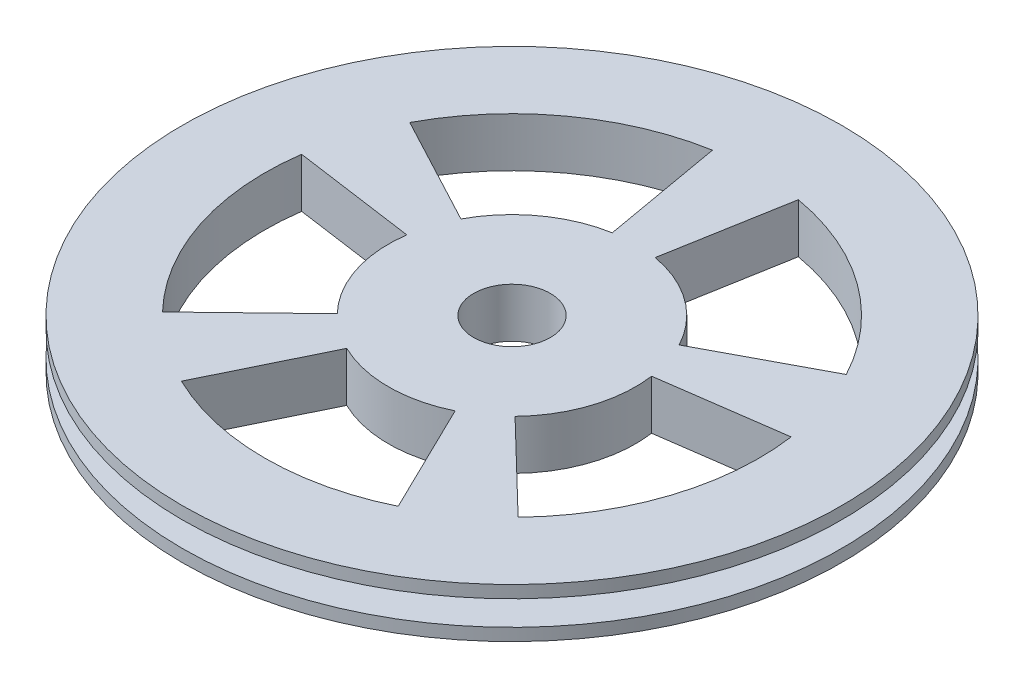
ISO-10303-21;
HEADER;
FILE_DESCRIPTION(('STEP AP214'),'2;1');
FILE_NAME('part.step','',(''),(''),'','','');
FILE_SCHEMA(('AUTOMOTIVE_DESIGN { 1 0 10303 214 1 1 1 1 }'));
ENDSEC;
DATA;
#1=APPLICATION_CONTEXT('core data for automotive mechanical design processes');
#2=APPLICATION_PROTOCOL_DEFINITION('international standard','automotive_design',2000,#1);
#3=PRODUCT_CONTEXT('',#1,'mechanical');
#4=PRODUCT('Part','Part','',(#3));
#5=PRODUCT_RELATED_PRODUCT_CATEGORY('part','',(#4));
#6=PRODUCT_DEFINITION_FORMATION('','',#4);
#7=PRODUCT_DEFINITION_CONTEXT('part definition',#1,'design');
#8=PRODUCT_DEFINITION('design','',#6,#7);
#9=PRODUCT_DEFINITION_SHAPE('','',#8);
#10=(LENGTH_UNIT() NAMED_UNIT(*) SI_UNIT(.MILLI.,.METRE.));
#11=(NAMED_UNIT(*) PLANE_ANGLE_UNIT() SI_UNIT($,.RADIAN.));
#12=(NAMED_UNIT(*) SI_UNIT($,.STERADIAN.) SOLID_ANGLE_UNIT());
#13=UNCERTAINTY_MEASURE_WITH_UNIT(LENGTH_MEASURE(1.E-05),#10,'distance_accuracy_value','');
#14=(GEOMETRIC_REPRESENTATION_CONTEXT(3) GLOBAL_UNCERTAINTY_ASSIGNED_CONTEXT((#13)) GLOBAL_UNIT_ASSIGNED_CONTEXT((#10,
#11,#12)) REPRESENTATION_CONTEXT('',''));
#15=CARTESIAN_POINT('',(0.,0.,0.));
#16=DIRECTION('',(0.,0.,1.));
#17=DIRECTION('',(1.,0.,0.));
#18=AXIS2_PLACEMENT_3D('',#15,#16,#17);
#19=CARTESIAN_POINT('',(0.,3.,0.));
#20=DIRECTION('',(0.,-1.,0.));
#21=DIRECTION('',(0.,0.,-1.));
#22=AXIS2_PLACEMENT_3D('',#19,#20,#21);
#23=CYLINDRICAL_SURFACE('',#22,20.);
#24=CARTESIAN_POINT('',(0.,0.,0.));
#25=DIRECTION('',(0.,1.,0.));
#26=DIRECTION('',(0.,0.,1.));
#27=AXIS2_PLACEMENT_3D('',#24,#25,#26);
#28=CIRCLE('',#27,20.);
#29=CARTESIAN_POINT('',(0.,0.,20.));
#30=VERTEX_POINT('',#29);
#31=EDGE_CURVE('E241',#30,#30,#28,.T.);
#32=ORIENTED_EDGE('',*,*,#31,.T.);
#33=EDGE_LOOP('',(#32));
#34=FACE_BOUND('',#33,.T.);
#35=CARTESIAN_POINT('',(0.,0.75,0.));
#36=DIRECTION('',(0.,-1.,0.));
#37=DIRECTION('',(0.,0.,-1.));
#38=AXIS2_PLACEMENT_3D('',#35,#36,#37);
#39=CIRCLE('',#38,20.);
#40=CARTESIAN_POINT('',(0.,0.75,-20.));
#41=VERTEX_POINT('',#40);
#42=EDGE_CURVE('E230',#41,#41,#39,.T.);
#43=ORIENTED_EDGE('',*,*,#42,.T.);
#44=EDGE_LOOP('',(#43));
#45=FACE_BOUND('',#44,.T.);
#46=ADVANCED_FACE('F47',(#34,#45),#23,.T.);
#47=CARTESIAN_POINT('',(0.,3.,0.));
#48=DIRECTION('',(0.,-1.,0.));
#49=DIRECTION('',(0.,0.,-1.));
#50=AXIS2_PLACEMENT_3D('',#47,#48,#49);
#51=CYLINDRICAL_SURFACE('',#50,15.);
#52=CARTESIAN_POINT('',(0.,0.,0.));
#53=DIRECTION('',(0.,1.,0.));
#54=DIRECTION('',(0.,0.,1.));
#55=AXIS2_PLACEMENT_3D('',#52,#53,#54);
#56=CIRCLE('',#55,15.);
#57=CARTESIAN_POINT('',(-6.5755672018362,0.,13.4819106944875));
#58=VERTEX_POINT('',#57);
#59=CARTESIAN_POINT('',(6.57556720183612,0.,13.4819106944875));
#60=VERTEX_POINT('',#59);
#61=EDGE_CURVE('E297',#58,#60,#56,.T.);
#62=ORIENTED_EDGE('',*,*,#61,.F.);
#63=DIRECTION('',(0.,-1.,0.));
#64=VECTOR('',#63,1.);
#65=CARTESIAN_POINT('',(-6.5755672018362,3.,13.4819106944875));
#66=LINE('',#65,#64);
#67=CARTESIAN_POINT('',(-6.5755672018362,3.,13.4819106944875));
#68=VERTEX_POINT('',#67);
#69=EDGE_CURVE('E11',#68,#58,#66,.T.);
#70=ORIENTED_EDGE('',*,*,#69,.F.);
#71=CARTESIAN_POINT('',(0.,3.,0.));
#72=DIRECTION('',(0.,1.,0.));
#73=DIRECTION('',(0.,0.,1.));
#74=AXIS2_PLACEMENT_3D('',#71,#72,#73);
#75=CIRCLE('',#74,15.);
#76=CARTESIAN_POINT('',(6.57556720183612,3.,13.4819106944875));
#77=VERTEX_POINT('',#76);
#78=EDGE_CURVE('E214',#68,#77,#75,.T.);
#79=ORIENTED_EDGE('',*,*,#78,.T.);
#80=DIRECTION('',(0.,-1.,0.));
#81=VECTOR('',#80,1.);
#82=CARTESIAN_POINT('',(6.57556720183612,3.,13.4819106944875));
#83=LINE('',#82,#81);
#84=EDGE_CURVE('E138',#77,#60,#83,.T.);
#85=ORIENTED_EDGE('',*,*,#84,.T.);
#86=EDGE_LOOP('',(#62,#70,#79,#85));
#87=FACE_BOUND('',#86,.T.);
#88=ADVANCED_FACE('F465',(#87),#51,.F.);
#89=CARTESIAN_POINT('',(0.,3.,0.));
#90=DIRECTION('',(0.898794046299166,0.,0.43837114678908));
#91=DIRECTION('',(0.43837114678908,0.,-0.898794046299166));
#92=AXIS2_PLACEMENT_3D('',#89,#90,#91);
#93=PLANE('',#92);
#94=DIRECTION('',(-0.43837114678908,0.,0.898794046299166));
#95=VECTOR('',#94,1.);
#96=CARTESIAN_POINT('',(0.,0.,0.));
#97=LINE('',#96,#95);
#98=CARTESIAN_POINT('',(-3.2877836009181,0.,6.74095534724374));
#99=VERTEX_POINT('',#98);
#100=EDGE_CURVE('E202',#99,#58,#97,.T.);
#101=ORIENTED_EDGE('',*,*,#100,.F.);
#102=DIRECTION('',(0.,-1.,0.));
#103=VECTOR('',#102,1.);
#104=CARTESIAN_POINT('',(-3.2877836009181,3.,6.74095534724374));
#105=LINE('',#104,#103);
#106=CARTESIAN_POINT('',(-3.2877836009181,3.,6.74095534724374));
#107=VERTEX_POINT('',#106);
#108=EDGE_CURVE('E58',#107,#99,#105,.T.);
#109=ORIENTED_EDGE('',*,*,#108,.F.);
#110=DIRECTION('',(-0.43837114678908,0.,0.898794046299166));
#111=VECTOR('',#110,1.);
#112=CARTESIAN_POINT('',(0.,3.,0.));
#113=LINE('',#112,#111);
#114=EDGE_CURVE('E200',#107,#68,#113,.T.);
#115=ORIENTED_EDGE('',*,*,#114,.T.);
#116=ORIENTED_EDGE('',*,*,#69,.T.);
#117=EDGE_LOOP('',(#101,#109,#115,#116));
#118=FACE_BOUND('',#117,.T.);
#119=ADVANCED_FACE('F198',(#118),#93,.T.);
#120=CARTESIAN_POINT('',(0.,3.,0.));
#121=DIRECTION('',(0.,-1.,0.));
#122=DIRECTION('',(0.,0.,-1.));
#123=AXIS2_PLACEMENT_3D('',#120,#121,#122);
#124=CYLINDRICAL_SURFACE('',#123,7.5);
#125=CARTESIAN_POINT('',(0.,0.,0.));
#126=DIRECTION('',(0.,1.,0.));
#127=DIRECTION('',(0.,0.,1.));
#128=AXIS2_PLACEMENT_3D('',#125,#126,#127);
#129=CIRCLE('',#128,7.5);
#130=CARTESIAN_POINT('',(3.28778360091806,0.,6.74095534724376));
#131=VERTEX_POINT('',#130);
#132=EDGE_CURVE('E302',#99,#131,#129,.T.);
#133=ORIENTED_EDGE('',*,*,#132,.T.);
#134=DIRECTION('',(0.,-1.,0.));
#135=VECTOR('',#134,1.);
#136=CARTESIAN_POINT('',(3.28778360091806,3.,6.74095534724376));
#137=LINE('',#136,#135);
#138=CARTESIAN_POINT('',(3.28778360091806,3.,6.74095534724376));
#139=VERTEX_POINT('',#138);
#140=EDGE_CURVE('E206',#139,#131,#137,.T.);
#141=ORIENTED_EDGE('',*,*,#140,.F.);
#142=CARTESIAN_POINT('',(0.,3.,0.));
#143=DIRECTION('',(0.,1.,0.));
#144=DIRECTION('',(0.,0.,1.));
#145=AXIS2_PLACEMENT_3D('',#142,#143,#144);
#146=CIRCLE('',#145,7.5);
#147=EDGE_CURVE('E209',#107,#139,#146,.T.);
#148=ORIENTED_EDGE('',*,*,#147,.F.);
#149=ORIENTED_EDGE('',*,*,#108,.T.);
#150=EDGE_LOOP('',(#133,#141,#148,#149));
#151=FACE_BOUND('',#150,.T.);
#152=ADVANCED_FACE('F210',(#151),#124,.T.);
#153=CARTESIAN_POINT('',(0.,3.,0.));
#154=DIRECTION('',(-0.469471562785888,0.,-0.882947592858928));
#155=DIRECTION('',(-0.882947592858928,0.,0.469471562785888));
#156=AXIS2_PLACEMENT_3D('',#153,#154,#155);
#157=PLANE('',#156);
#158=DIRECTION('',(0.882947592858928,0.,-0.469471562785888));
#159=VECTOR('',#158,1.);
#160=CARTESIAN_POINT('',(0.,0.,0.));
#161=LINE('',#160,#159);
#162=CARTESIAN_POINT('',(6.62210694644196,0.,-3.52103672089416));
#163=VERTEX_POINT('',#162);
#164=CARTESIAN_POINT('',(13.2442138928839,0.,-7.04207344178832));
#165=VERTEX_POINT('',#164);
#166=EDGE_CURVE('E281',#163,#165,#161,.T.);
#167=ORIENTED_EDGE('',*,*,#166,.F.);
#168=DIRECTION('',(0.,-1.,0.));
#169=VECTOR('',#168,1.);
#170=CARTESIAN_POINT('',(6.62210694644196,3.,-3.52103672089416));
#171=LINE('',#170,#169);
#172=CARTESIAN_POINT('',(6.62210694644196,3.,-3.52103672089416));
#173=VERTEX_POINT('',#172);
#174=EDGE_CURVE('E310',#173,#163,#171,.T.);
#175=ORIENTED_EDGE('',*,*,#174,.F.);
#176=DIRECTION('',(0.882947592858928,0.,-0.469471562785888));
#177=VECTOR('',#176,1.);
#178=CARTESIAN_POINT('',(0.,3.,0.));
#179=LINE('',#178,#177);
#180=CARTESIAN_POINT('',(13.2442138928839,3.,-7.04207344178832));
#181=VERTEX_POINT('',#180);
#182=EDGE_CURVE('E425',#173,#181,#179,.T.);
#183=ORIENTED_EDGE('',*,*,#182,.T.);
#184=DIRECTION('',(0.,-1.,0.));
#185=VECTOR('',#184,1.);
#186=CARTESIAN_POINT('',(13.2442138928839,3.,-7.04207344178832));
#187=LINE('',#186,#185);
#188=EDGE_CURVE('E313',#181,#165,#187,.T.);
#189=ORIENTED_EDGE('',*,*,#188,.T.);
#190=EDGE_LOOP('',(#167,#175,#183,#189));
#191=FACE_BOUND('',#190,.T.);
#192=ADVANCED_FACE('F452',(#191),#157,.T.);
#193=CARTESIAN_POINT('',(0.,3.,0.));
#194=DIRECTION('',(0.,-1.,0.));
#195=DIRECTION('',(0.,0.,-1.));
#196=AXIS2_PLACEMENT_3D('',#193,#194,#195);
#197=CYLINDRICAL_SURFACE('',#196,7.5);
#198=CARTESIAN_POINT('',(0.,0.,0.));
#199=DIRECTION('',(0.,1.,0.));
#200=DIRECTION('',(0.,0.,1.));
#201=AXIS2_PLACEMENT_3D('',#198,#199,#200);
#202=CIRCLE('',#201,7.5);
#203=CARTESIAN_POINT('',(1.302361332502,0.,-7.38605814759156));
#204=VERTEX_POINT('',#203);
#205=EDGE_CURVE('E285',#163,#204,#202,.T.);
#206=ORIENTED_EDGE('',*,*,#205,.T.);
#207=DIRECTION('',(0.,-1.,0.));
#208=VECTOR('',#207,1.);
#209=CARTESIAN_POINT('',(1.302361332502,3.,-7.38605814759156));
#210=LINE('',#209,#208);
#211=CARTESIAN_POINT('',(1.302361332502,3.,-7.38605814759156));
#212=VERTEX_POINT('',#211);
#213=EDGE_CURVE('E320',#212,#204,#210,.T.);
#214=ORIENTED_EDGE('',*,*,#213,.F.);
#215=CARTESIAN_POINT('',(0.,3.,0.));
#216=DIRECTION('',(0.,1.,0.));
#217=DIRECTION('',(0.,0.,1.));
#218=AXIS2_PLACEMENT_3D('',#215,#216,#217);
#219=CIRCLE('',#218,7.5);
#220=EDGE_CURVE('E429',#173,#212,#219,.T.);
#221=ORIENTED_EDGE('',*,*,#220,.F.);
#222=ORIENTED_EDGE('',*,*,#174,.T.);
#223=EDGE_LOOP('',(#206,#214,#221,#222));
#224=FACE_BOUND('',#223,.T.);
#225=ADVANCED_FACE('F454',(#224),#197,.T.);
#226=CARTESIAN_POINT('',(0.,3.,0.));
#227=DIRECTION('',(-0.984807753012207,0.,-0.173648177666934));
#228=DIRECTION('',(-0.173648177666934,0.,0.984807753012208));
#229=AXIS2_PLACEMENT_3D('',#226,#227,#228);
#230=PLANE('',#229);
#231=DIRECTION('',(0.173648177666934,0.,-0.984807753012208));
#232=VECTOR('',#231,1.);
#233=CARTESIAN_POINT('',(0.,0.,0.));
#234=LINE('',#233,#232);
#235=CARTESIAN_POINT('',(2.60472266500401,0.,-14.7721162951831));
#236=VERTEX_POINT('',#235);
#237=EDGE_CURVE('E289',#204,#236,#234,.T.);
#238=ORIENTED_EDGE('',*,*,#237,.T.);
#239=DIRECTION('',(0.,-1.,0.));
#240=VECTOR('',#239,1.);
#241=CARTESIAN_POINT('',(2.60472266500401,3.,-14.7721162951831));
#242=LINE('',#241,#240);
#243=CARTESIAN_POINT('',(2.60472266500401,3.,-14.7721162951831));
#244=VERTEX_POINT('',#243);
#245=EDGE_CURVE('E316',#244,#236,#242,.T.);
#246=ORIENTED_EDGE('',*,*,#245,.F.);
#247=DIRECTION('',(0.173648177666934,0.,-0.984807753012208));
#248=VECTOR('',#247,1.);
#249=CARTESIAN_POINT('',(0.,3.,0.));
#250=LINE('',#249,#248);
#251=EDGE_CURVE('E433',#212,#244,#250,.T.);
#252=ORIENTED_EDGE('',*,*,#251,.F.);
#253=ORIENTED_EDGE('',*,*,#213,.T.);
#254=EDGE_LOOP('',(#238,#246,#252,#253));
#255=FACE_BOUND('',#254,.T.);
#256=ADVANCED_FACE('F447',(#255),#230,.F.);
#257=CARTESIAN_POINT('',(0.,3.,0.));
#258=DIRECTION('',(-0.984807753012208,0.,0.173648177666927));
#259=DIRECTION('',(0.173648177666927,0.,0.984807753012209));
#260=AXIS2_PLACEMENT_3D('',#257,#258,#259);
#261=PLANE('',#260);
#262=DIRECTION('',(-0.173648177666927,0.,-0.984807753012209));
#263=VECTOR('',#262,1.);
#264=CARTESIAN_POINT('',(0.,0.,0.));
#265=LINE('',#264,#263);
#266=CARTESIAN_POINT('',(-1.30236133250196,0.,-7.38605814759156));
#267=VERTEX_POINT('',#266);
#268=CARTESIAN_POINT('',(-2.60472266500391,0.,-14.7721162951831));
#269=VERTEX_POINT('',#268);
#270=EDGE_CURVE('E265',#267,#269,#265,.T.);
#271=ORIENTED_EDGE('',*,*,#270,.F.);
#272=DIRECTION('',(0.,-1.,0.));
#273=VECTOR('',#272,1.);
#274=CARTESIAN_POINT('',(-1.30236133250196,3.,-7.38605814759156));
#275=LINE('',#274,#273);
#276=CARTESIAN_POINT('',(-1.30236133250196,3.,-7.38605814759156));
#277=VERTEX_POINT('',#276);
#278=EDGE_CURVE('E317',#277,#267,#275,.T.);
#279=ORIENTED_EDGE('',*,*,#278,.F.);
#280=DIRECTION('',(-0.173648177666927,0.,-0.984807753012209));
#281=VECTOR('',#280,1.);
#282=CARTESIAN_POINT('',(0.,3.,0.));
#283=LINE('',#282,#281);
#284=CARTESIAN_POINT('',(-2.60472266500391,3.,-14.7721162951831));
#285=VERTEX_POINT('',#284);
#286=EDGE_CURVE('E410',#277,#285,#283,.T.);
#287=ORIENTED_EDGE('',*,*,#286,.T.);
#288=DIRECTION('',(0.,-1.,0.));
#289=VECTOR('',#288,1.);
#290=CARTESIAN_POINT('',(-2.60472266500391,3.,-14.7721162951831));
#291=LINE('',#290,#289);
#292=EDGE_CURVE('E326',#285,#269,#291,.T.);
#293=ORIENTED_EDGE('',*,*,#292,.T.);
#294=EDGE_LOOP('',(#271,#279,#287,#293));
#295=FACE_BOUND('',#294,.T.);
#296=ADVANCED_FACE('F461',(#295),#261,.T.);
#297=CARTESIAN_POINT('',(0.,3.,0.));
#298=DIRECTION('',(0.,-1.,0.));
#299=DIRECTION('',(0.,0.,-1.));
#300=AXIS2_PLACEMENT_3D('',#297,#298,#299);
#301=CYLINDRICAL_SURFACE('',#300,7.5);
#302=CARTESIAN_POINT('',(0.,0.,0.));
#303=DIRECTION('',(0.,1.,0.));
#304=DIRECTION('',(0.,0.,1.));
#305=AXIS2_PLACEMENT_3D('',#302,#303,#304);
#306=CIRCLE('',#305,7.5);
#307=CARTESIAN_POINT('',(-6.62210694644194,0.,-3.5210367208942));
#308=VERTEX_POINT('',#307);
#309=EDGE_CURVE('E269',#267,#308,#306,.T.);
#310=ORIENTED_EDGE('',*,*,#309,.T.);
#311=DIRECTION('',(0.,-1.,0.));
#312=VECTOR('',#311,1.);
#313=CARTESIAN_POINT('',(-6.62210694644194,3.,-3.5210367208942));
#314=LINE('',#313,#312);
#315=CARTESIAN_POINT('',(-6.62210694644194,3.,-3.5210367208942));
#316=VERTEX_POINT('',#315);
#317=EDGE_CURVE('E333',#316,#308,#314,.T.);
#318=ORIENTED_EDGE('',*,*,#317,.F.);
#319=CARTESIAN_POINT('',(0.,3.,0.));
#320=DIRECTION('',(0.,1.,0.));
#321=DIRECTION('',(0.,0.,1.));
#322=AXIS2_PLACEMENT_3D('',#319,#320,#321);
#323=CIRCLE('',#322,7.5);
#324=EDGE_CURVE('E414',#277,#316,#323,.T.);
#325=ORIENTED_EDGE('',*,*,#324,.F.);
#326=ORIENTED_EDGE('',*,*,#278,.T.);
#327=EDGE_LOOP('',(#310,#318,#325,#326));
#328=FACE_BOUND('',#327,.T.);
#329=ADVANCED_FACE('F512',(#328),#301,.T.);
#330=CARTESIAN_POINT('',(0.,3.,0.));
#331=DIRECTION('',(-0.469471562785894,0.,0.882947592858925));
#332=DIRECTION('',(0.882947592858925,0.,0.469471562785894));
#333=AXIS2_PLACEMENT_3D('',#330,#331,#332);
#334=PLANE('',#333);
#335=DIRECTION('',(-0.882947592858925,0.,-0.469471562785894));
#336=VECTOR('',#335,1.);
#337=CARTESIAN_POINT('',(0.,0.,0.));
#338=LINE('',#337,#336);
#339=CARTESIAN_POINT('',(-13.2442138928839,0.,-7.0420734417884));
#340=VERTEX_POINT('',#339);
#341=EDGE_CURVE('E273',#308,#340,#338,.T.);
#342=ORIENTED_EDGE('',*,*,#341,.T.);
#343=DIRECTION('',(0.,-1.,0.));
#344=VECTOR('',#343,1.);
#345=CARTESIAN_POINT('',(-13.2442138928839,3.,-7.0420734417884));
#346=LINE('',#345,#344);
#347=CARTESIAN_POINT('',(-13.2442138928839,3.,-7.0420734417884));
#348=VERTEX_POINT('',#347);
#349=EDGE_CURVE('E329',#348,#340,#346,.T.);
#350=ORIENTED_EDGE('',*,*,#349,.F.);
#351=DIRECTION('',(-0.882947592858925,0.,-0.469471562785894));
#352=VECTOR('',#351,1.);
#353=CARTESIAN_POINT('',(0.,3.,0.));
#354=LINE('',#353,#352);
#355=EDGE_CURVE('E418',#316,#348,#354,.T.);
#356=ORIENTED_EDGE('',*,*,#355,.F.);
#357=ORIENTED_EDGE('',*,*,#317,.T.);
#358=EDGE_LOOP('',(#342,#350,#356,#357));
#359=FACE_BOUND('',#358,.T.);
#360=ADVANCED_FACE('F514',(#359),#334,.F.);
#361=CARTESIAN_POINT('',(0.,3.,0.));
#362=DIRECTION('',(0.,-1.,0.));
#363=DIRECTION('',(0.,0.,-1.));
#364=AXIS2_PLACEMENT_3D('',#361,#362,#363);
#365=CYLINDRICAL_SURFACE('',#364,7.5);
#366=CARTESIAN_POINT('',(0.,0.,0.));
#367=DIRECTION('',(0.,1.,0.));
#368=DIRECTION('',(0.,0.,1.));
#369=AXIS2_PLACEMENT_3D('',#366,#367,#368);
#370=CIRCLE('',#369,7.5);
#371=CARTESIAN_POINT('',(-7.42701051556177,0.,-1.04379825720051));
#372=VERTEX_POINT('',#371);
#373=CARTESIAN_POINT('',(-5.3950485025399,0.,5.20993777844246));
#374=VERTEX_POINT('',#373);
#375=EDGE_CURVE('E245',#372,#374,#370,.T.);
#376=ORIENTED_EDGE('',*,*,#375,.T.);
#377=DIRECTION('',(0.,-1.,0.));
#378=VECTOR('',#377,1.);
#379=CARTESIAN_POINT('',(-5.3950485025399,3.,5.20993777844246));
#380=LINE('',#379,#378);
#381=CARTESIAN_POINT('',(-5.3950485025399,3.,5.20993777844246));
#382=VERTEX_POINT('',#381);
#383=EDGE_CURVE('E330',#382,#374,#380,.T.);
#384=ORIENTED_EDGE('',*,*,#383,.F.);
#385=CARTESIAN_POINT('',(0.,3.,0.));
#386=DIRECTION('',(0.,1.,0.));
#387=DIRECTION('',(0.,0.,1.));
#388=AXIS2_PLACEMENT_3D('',#385,#386,#387);
#389=CIRCLE('',#388,7.5);
#390=CARTESIAN_POINT('',(-7.42701051556177,3.,-1.04379825720051));
#391=VERTEX_POINT('',#390);
#392=EDGE_CURVE('E387',#391,#382,#389,.T.);
#393=ORIENTED_EDGE('',*,*,#392,.F.);
#394=DIRECTION('',(0.,-1.,0.));
#395=VECTOR('',#394,1.);
#396=CARTESIAN_POINT('',(-7.42701051556177,3.,-1.04379825720051));
#397=LINE('',#396,#395);
#398=EDGE_CURVE('E339',#391,#372,#397,.T.);
#399=ORIENTED_EDGE('',*,*,#398,.T.);
#400=EDGE_LOOP('',(#376,#384,#393,#399));
#401=FACE_BOUND('',#400,.T.);
#402=ADVANCED_FACE('F558',(#401),#365,.T.);
#403=CARTESIAN_POINT('',(0.,3.,0.));
#404=DIRECTION('',(0.694658370458995,0.,0.719339800338653));
#405=DIRECTION('',(0.719339800338654,0.,-0.694658370458995));
#406=AXIS2_PLACEMENT_3D('',#403,#404,#405);
#407=PLANE('',#406);
#408=DIRECTION('',(-0.719339800338654,0.,0.694658370458995));
#409=VECTOR('',#408,1.);
#410=CARTESIAN_POINT('',(0.,0.,0.));
#411=LINE('',#410,#409);
#412=CARTESIAN_POINT('',(-10.7900970050798,0.,10.4198755568849));
#413=VERTEX_POINT('',#412);
#414=EDGE_CURVE('E249',#374,#413,#411,.T.);
#415=ORIENTED_EDGE('',*,*,#414,.T.);
#416=DIRECTION('',(0.,-1.,0.));
#417=VECTOR('',#416,1.);
#418=CARTESIAN_POINT('',(-10.7900970050798,3.,10.4198755568849));
#419=LINE('',#418,#417);
#420=CARTESIAN_POINT('',(-10.7900970050798,3.,10.4198755568849));
#421=VERTEX_POINT('',#420);
#422=EDGE_CURVE('E345',#421,#413,#419,.T.);
#423=ORIENTED_EDGE('',*,*,#422,.F.);
#424=DIRECTION('',(-0.719339800338654,0.,0.694658370458995));
#425=VECTOR('',#424,1.);
#426=CARTESIAN_POINT('',(0.,3.,0.));
#427=LINE('',#426,#425);
#428=EDGE_CURVE('E395',#382,#421,#427,.T.);
#429=ORIENTED_EDGE('',*,*,#428,.F.);
#430=ORIENTED_EDGE('',*,*,#383,.T.);
#431=EDGE_LOOP('',(#415,#423,#429,#430));
#432=FACE_BOUND('',#431,.T.);
#433=ADVANCED_FACE('F552',(#432),#407,.F.);
#434=CARTESIAN_POINT('',(0.,3.,0.));
#435=DIRECTION('',(0.,-1.,0.));
#436=DIRECTION('',(0.,0.,-1.));
#437=AXIS2_PLACEMENT_3D('',#434,#435,#436);
#438=CYLINDRICAL_SURFACE('',#437,15.);
#439=CARTESIAN_POINT('',(0.,0.,0.));
#440=DIRECTION('',(0.,1.,0.));
#441=DIRECTION('',(0.,0.,1.));
#442=AXIS2_PLACEMENT_3D('',#439,#440,#441);
#443=CIRCLE('',#442,15.);
#444=CARTESIAN_POINT('',(-14.8540210311235,0.,-2.08759651440103));
#445=VERTEX_POINT('',#444);
#446=EDGE_CURVE('E253',#445,#413,#443,.T.);
#447=ORIENTED_EDGE('',*,*,#446,.F.);
#448=DIRECTION('',(0.,-1.,0.));
#449=VECTOR('',#448,1.);
#450=CARTESIAN_POINT('',(-14.8540210311235,3.,-2.08759651440103));
#451=LINE('',#450,#449);
#452=CARTESIAN_POINT('',(-14.8540210311235,3.,-2.08759651440103));
#453=VERTEX_POINT('',#452);
#454=EDGE_CURVE('E342',#453,#445,#451,.T.);
#455=ORIENTED_EDGE('',*,*,#454,.F.);
#456=CARTESIAN_POINT('',(0.,3.,0.));
#457=DIRECTION('',(0.,1.,0.));
#458=DIRECTION('',(0.,0.,1.));
#459=AXIS2_PLACEMENT_3D('',#456,#457,#458);
#460=CIRCLE('',#459,15.);
#461=EDGE_CURVE('E398',#453,#421,#460,.T.);
#462=ORIENTED_EDGE('',*,*,#461,.T.);
#463=ORIENTED_EDGE('',*,*,#422,.T.);
#464=EDGE_LOOP('',(#447,#455,#462,#463));
#465=FACE_BOUND('',#464,.T.);
#466=ADVANCED_FACE('F548',(#465),#438,.F.);
#467=CARTESIAN_POINT('',(0.,3.,0.));
#468=DIRECTION('',(0.,-1.,0.));
#469=DIRECTION('',(0.,0.,-1.));
#470=AXIS2_PLACEMENT_3D('',#467,#468,#469);
#471=CYLINDRICAL_SURFACE('',#470,15.);
#472=CARTESIAN_POINT('',(0.,0.,0.));
#473=DIRECTION('',(0.,1.,0.));
#474=DIRECTION('',(0.,0.,1.));
#475=AXIS2_PLACEMENT_3D('',#472,#473,#474);
#476=CIRCLE('',#475,15.);
#477=CARTESIAN_POINT('',(10.7900970050797,0.,10.419875556885));
#478=VERTEX_POINT('',#477);
#479=CARTESIAN_POINT('',(14.8540210311236,0.,-2.08759651440093));
#480=VERTEX_POINT('',#479);
#481=EDGE_CURVE('E225',#478,#480,#476,.T.);
#482=ORIENTED_EDGE('',*,*,#481,.F.);
#483=DIRECTION('',(0.,-1.,0.));
#484=VECTOR('',#483,1.);
#485=CARTESIAN_POINT('',(10.7900970050797,3.,10.419875556885));
#486=LINE('',#485,#484);
#487=CARTESIAN_POINT('',(10.7900970050797,3.,10.419875556885));
#488=VERTEX_POINT('',#487);
#489=EDGE_CURVE('E51',#488,#478,#486,.T.);
#490=ORIENTED_EDGE('',*,*,#489,.F.);
#491=CARTESIAN_POINT('',(0.,3.,0.));
#492=DIRECTION('',(0.,1.,0.));
#493=DIRECTION('',(0.,0.,1.));
#494=AXIS2_PLACEMENT_3D('',#491,#492,#493);
#495=CIRCLE('',#494,15.);
#496=CARTESIAN_POINT('',(14.8540210311236,3.,-2.08759651440093));
#497=VERTEX_POINT('',#496);
#498=EDGE_CURVE('E307',#488,#497,#495,.T.);
#499=ORIENTED_EDGE('',*,*,#498,.T.);
#500=DIRECTION('',(0.,-1.,0.));
#501=VECTOR('',#500,1.);
#502=CARTESIAN_POINT('',(14.8540210311236,3.,-2.08759651440093));
#503=LINE('',#502,#501);
#504=EDGE_CURVE('E224',#497,#480,#503,.T.);
#505=ORIENTED_EDGE('',*,*,#504,.T.);
#506=EDGE_LOOP('',(#482,#490,#499,#505));
#507=FACE_BOUND('',#506,.T.);
#508=ADVANCED_FACE('F49',(#507),#471,.F.);
#509=CARTESIAN_POINT('',(0.,3.,0.));
#510=DIRECTION('',(0.694658370458999,0.,-0.719339800338649));
#511=DIRECTION('',(-0.719339800338649,0.,-0.694658370458999));
#512=AXIS2_PLACEMENT_3D('',#509,#510,#511);
#513=PLANE('',#512);
#514=DIRECTION('',(0.719339800338649,0.,0.694658370458999));
#515=VECTOR('',#514,1.);
#516=CARTESIAN_POINT('',(0.,0.,0.));
#517=LINE('',#516,#515);
#518=CARTESIAN_POINT('',(5.39504850253987,0.,5.20993777844249));
#519=VERTEX_POINT('',#518);
#520=EDGE_CURVE('E229',#519,#478,#517,.T.);
#521=ORIENTED_EDGE('',*,*,#520,.F.);
#522=DIRECTION('',(0.,-1.,0.));
#523=VECTOR('',#522,1.);
#524=CARTESIAN_POINT('',(5.39504850253987,3.,5.20993777844249));
#525=LINE('',#524,#523);
#526=CARTESIAN_POINT('',(5.39504850253987,3.,5.20993777844249));
#527=VERTEX_POINT('',#526);
#528=EDGE_CURVE('E356',#527,#519,#525,.T.);
#529=ORIENTED_EDGE('',*,*,#528,.F.);
#530=DIRECTION('',(0.719339800338649,0.,0.694658370458999));
#531=VECTOR('',#530,1.);
#532=CARTESIAN_POINT('',(0.,3.,0.));
#533=LINE('',#532,#531);
#534=EDGE_CURVE('E367',#527,#488,#533,.T.);
#535=ORIENTED_EDGE('',*,*,#534,.T.);
#536=ORIENTED_EDGE('',*,*,#489,.T.);
#537=EDGE_LOOP('',(#521,#529,#535,#536));
#538=FACE_BOUND('',#537,.T.);
#539=ADVANCED_FACE('F365',(#538),#513,.T.);
#540=CARTESIAN_POINT('',(0.,3.,0.));
#541=DIRECTION('',(0.,-1.,0.));
#542=DIRECTION('',(0.,0.,-1.));
#543=AXIS2_PLACEMENT_3D('',#540,#541,#542);
#544=CYLINDRICAL_SURFACE('',#543,7.5);
#545=CARTESIAN_POINT('',(0.,0.,0.));
#546=DIRECTION('',(0.,1.,0.));
#547=DIRECTION('',(0.,0.,1.));
#548=AXIS2_PLACEMENT_3D('',#545,#546,#547);
#549=CIRCLE('',#548,7.5);
#550=CARTESIAN_POINT('',(7.42701051556178,0.,-1.04379825720047));
#551=VERTEX_POINT('',#550);
#552=EDGE_CURVE('E234',#519,#551,#549,.T.);
#553=ORIENTED_EDGE('',*,*,#552,.T.);
#554=DIRECTION('',(0.,-1.,0.));
#555=VECTOR('',#554,1.);
#556=CARTESIAN_POINT('',(7.42701051556178,3.,-1.04379825720047));
#557=LINE('',#556,#555);
#558=CARTESIAN_POINT('',(7.42701051556178,3.,-1.04379825720047));
#559=VERTEX_POINT('',#558);
#560=EDGE_CURVE('E353',#559,#551,#557,.T.);
#561=ORIENTED_EDGE('',*,*,#560,.F.);
#562=CARTESIAN_POINT('',(0.,3.,0.));
#563=DIRECTION('',(0.,1.,0.));
#564=DIRECTION('',(0.,0.,1.));
#565=AXIS2_PLACEMENT_3D('',#562,#563,#564);
#566=CIRCLE('',#565,7.5);
#567=EDGE_CURVE('E382',#527,#559,#566,.T.);
#568=ORIENTED_EDGE('',*,*,#567,.F.);
#569=ORIENTED_EDGE('',*,*,#528,.T.);
#570=EDGE_LOOP('',(#553,#561,#568,#569));
#571=FACE_BOUND('',#570,.T.);
#572=ADVANCED_FACE('F374',(#571),#544,.T.);
#573=CARTESIAN_POINT('',(0.,3.,0.));
#574=DIRECTION('',(0.,-1.,0.));
#575=DIRECTION('',(0.,0.,-1.));
#576=AXIS2_PLACEMENT_3D('',#573,#574,#575);
#577=CYLINDRICAL_SURFACE('',#576,15.);
#578=CARTESIAN_POINT('',(0.,0.,0.));
#579=DIRECTION('',(0.,1.,0.));
#580=DIRECTION('',(0.,0.,1.));
#581=AXIS2_PLACEMENT_3D('',#578,#579,#580);
#582=CIRCLE('',#581,15.);
#583=EDGE_CURVE('E293',#165,#236,#582,.T.);
#584=ORIENTED_EDGE('',*,*,#583,.F.);
#585=ORIENTED_EDGE('',*,*,#188,.F.);
#586=CARTESIAN_POINT('',(0.,3.,0.));
#587=DIRECTION('',(0.,1.,0.));
#588=DIRECTION('',(0.,0.,1.));
#589=AXIS2_PLACEMENT_3D('',#586,#587,#588);
#590=CIRCLE('',#589,15.);
#591=EDGE_CURVE('E218',#181,#244,#590,.T.);
#592=ORIENTED_EDGE('',*,*,#591,.T.);
#593=ORIENTED_EDGE('',*,*,#245,.T.);
#594=EDGE_LOOP('',(#584,#585,#592,#593));
#595=FACE_BOUND('',#594,.T.);
#596=ADVANCED_FACE('F440',(#595),#577,.F.);
#597=CARTESIAN_POINT('',(0.,3.,0.));
#598=DIRECTION('',(0.,-1.,0.));
#599=DIRECTION('',(0.,0.,-1.));
#600=AXIS2_PLACEMENT_3D('',#597,#598,#599);
#601=CYLINDRICAL_SURFACE('',#600,15.);
#602=CARTESIAN_POINT('',(0.,0.,0.));
#603=DIRECTION('',(0.,1.,0.));
#604=DIRECTION('',(0.,0.,1.));
#605=AXIS2_PLACEMENT_3D('',#602,#603,#604);
#606=CIRCLE('',#605,15.);
#607=EDGE_CURVE('E277',#269,#340,#606,.T.);
#608=ORIENTED_EDGE('',*,*,#607,.F.);
#609=ORIENTED_EDGE('',*,*,#292,.F.);
#610=CARTESIAN_POINT('',(0.,3.,0.));
#611=DIRECTION('',(0.,1.,0.));
#612=DIRECTION('',(0.,0.,1.));
#613=AXIS2_PLACEMENT_3D('',#610,#611,#612);
#614=CIRCLE('',#613,15.);
#615=EDGE_CURVE('E421',#285,#348,#614,.T.);
#616=ORIENTED_EDGE('',*,*,#615,.T.);
#617=ORIENTED_EDGE('',*,*,#349,.T.);
#618=EDGE_LOOP('',(#608,#609,#616,#617));
#619=FACE_BOUND('',#618,.T.);
#620=ADVANCED_FACE('F518',(#619),#601,.F.);
#621=CARTESIAN_POINT('',(0.,3.,0.));
#622=DIRECTION('',(0.,-1.,0.));
#623=DIRECTION('',(0.,0.,-1.));
#624=AXIS2_PLACEMENT_3D('',#621,#622,#623);
#625=CYLINDRICAL_SURFACE('',#624,2.325);
#626=CARTESIAN_POINT('',(0.,3.,0.));
#627=DIRECTION('',(0.,1.,0.));
#628=DIRECTION('',(0.,0.,1.));
#629=AXIS2_PLACEMENT_3D('',#626,#627,#628);
#630=CIRCLE('',#629,2.325);
#631=CARTESIAN_POINT('',(0.,3.,2.325));
#632=VERTEX_POINT('',#631);
#633=EDGE_CURVE('E406',#632,#632,#630,.T.);
#634=ORIENTED_EDGE('',*,*,#633,.T.);
#635=EDGE_LOOP('',(#634));
#636=FACE_BOUND('',#635,.T.);
#637=CARTESIAN_POINT('',(0.,0.,0.));
#638=DIRECTION('',(0.,1.,0.));
#639=DIRECTION('',(0.,0.,1.));
#640=AXIS2_PLACEMENT_3D('',#637,#638,#639);
#641=CIRCLE('',#640,2.325);
#642=CARTESIAN_POINT('',(0.,0.,2.325));
#643=VERTEX_POINT('',#642);
#644=EDGE_CURVE('E261',#643,#643,#641,.T.);
#645=ORIENTED_EDGE('',*,*,#644,.F.);
#646=EDGE_LOOP('',(#645));
#647=FACE_BOUND('',#646,.T.);
#648=ADVANCED_FACE('F486',(#636,#647),#625,.F.);
#649=CARTESIAN_POINT('',(0.,3.,0.));
#650=DIRECTION('',(-0.139173100960069,0.,0.99026806874157));
#651=DIRECTION('',(0.99026806874157,0.,0.139173100960069));
#652=AXIS2_PLACEMENT_3D('',#649,#650,#651);
#653=PLANE('',#652);
#654=DIRECTION('',(-0.99026806874157,0.,-0.139173100960069));
#655=VECTOR('',#654,1.);
#656=CARTESIAN_POINT('',(0.,0.,0.));
#657=LINE('',#656,#655);
#658=EDGE_CURVE('E257',#372,#445,#657,.T.);
#659=ORIENTED_EDGE('',*,*,#658,.F.);
#660=ORIENTED_EDGE('',*,*,#398,.F.);
#661=DIRECTION('',(-0.99026806874157,0.,-0.139173100960069));
#662=VECTOR('',#661,1.);
#663=CARTESIAN_POINT('',(0.,3.,0.));
#664=LINE('',#663,#662);
#665=EDGE_CURVE('E402',#391,#453,#664,.T.);
#666=ORIENTED_EDGE('',*,*,#665,.T.);
#667=ORIENTED_EDGE('',*,*,#454,.T.);
#668=EDGE_LOOP('',(#659,#660,#666,#667));
#669=FACE_BOUND('',#668,.T.);
#670=ADVANCED_FACE('F478',(#669),#653,.T.);
#671=CARTESIAN_POINT('',(0.,2.25,0.));
#672=DIRECTION('',(0.,-1.,0.));
#673=DIRECTION('',(0.,0.,-1.));
#674=AXIS2_PLACEMENT_3D('',#671,#672,#673);
#675=CIRCLE('',#674,20.);
#676=CARTESIAN_POINT('',(0.,2.25,-20.));
#677=VERTEX_POINT('',#676);
#678=EDGE_CURVE('E492',#677,#677,#675,.T.);
#679=ORIENTED_EDGE('',*,*,#678,.F.);
#680=EDGE_LOOP('',(#679));
#681=FACE_BOUND('',#680,.T.);
#682=CARTESIAN_POINT('',(0.,3.,0.));
#683=DIRECTION('',(0.,1.,0.));
#684=DIRECTION('',(0.,0.,1.));
#685=AXIS2_PLACEMENT_3D('',#682,#683,#684);
#686=CIRCLE('',#685,20.);
#687=CARTESIAN_POINT('',(0.,3.,20.));
#688=VERTEX_POINT('',#687);
#689=EDGE_CURVE('E381',#688,#688,#686,.T.);
#690=ORIENTED_EDGE('',*,*,#689,.F.);
#691=EDGE_LOOP('',(#690));
#692=FACE_BOUND('',#691,.T.);
#693=ADVANCED_FACE('F468',(#681,#692),#23,.T.);
#694=CARTESIAN_POINT('',(0.,3.,0.));
#695=DIRECTION('',(-0.139173100960062,0.,-0.990268068741571));
#696=DIRECTION('',(-0.990268068741571,0.,0.139173100960062));
#697=AXIS2_PLACEMENT_3D('',#694,#695,#696);
#698=PLANE('',#697);
#699=DIRECTION('',(0.990268068741571,0.,-0.139173100960062));
#700=VECTOR('',#699,1.);
#701=CARTESIAN_POINT('',(0.,0.,0.));
#702=LINE('',#701,#700);
#703=EDGE_CURVE('E237',#551,#480,#702,.T.);
#704=ORIENTED_EDGE('',*,*,#703,.T.);
#705=ORIENTED_EDGE('',*,*,#504,.F.);
#706=DIRECTION('',(0.990268068741571,0.,-0.139173100960062));
#707=VECTOR('',#706,1.);
#708=CARTESIAN_POINT('',(0.,3.,0.));
#709=LINE('',#708,#707);
#710=EDGE_CURVE('E378',#559,#497,#709,.T.);
#711=ORIENTED_EDGE('',*,*,#710,.F.);
#712=ORIENTED_EDGE('',*,*,#560,.T.);
#713=EDGE_LOOP('',(#704,#705,#711,#712));
#714=FACE_BOUND('',#713,.T.);
#715=ADVANCED_FACE('F377',(#714),#698,.F.);
#716=CARTESIAN_POINT('',(0.,3.,0.));
#717=DIRECTION('',(0.898794046299168,0.,-0.438371146789074));
#718=DIRECTION('',(-0.438371146789075,0.,-0.898794046299169));
#719=AXIS2_PLACEMENT_3D('',#716,#717,#718);
#720=PLANE('',#719);
#721=DIRECTION('',(0.438371146789075,0.,0.898794046299168));
#722=VECTOR('',#721,1.);
#723=CARTESIAN_POINT('',(0.,0.,0.));
#724=LINE('',#723,#722);
#725=EDGE_CURVE('E131',#131,#60,#724,.T.);
#726=ORIENTED_EDGE('',*,*,#725,.T.);
#727=ORIENTED_EDGE('',*,*,#84,.F.);
#728=DIRECTION('',(0.438371146789075,0.,0.898794046299168));
#729=VECTOR('',#728,1.);
#730=CARTESIAN_POINT('',(0.,3.,0.));
#731=LINE('',#730,#729);
#732=EDGE_CURVE('E67',#139,#77,#731,.T.);
#733=ORIENTED_EDGE('',*,*,#732,.F.);
#734=ORIENTED_EDGE('',*,*,#140,.T.);
#735=EDGE_LOOP('',(#726,#727,#733,#734));
#736=FACE_BOUND('',#735,.T.);
#737=ADVANCED_FACE('F484',(#736),#720,.F.);
#738=CARTESIAN_POINT('',(0.,3.,0.));
#739=DIRECTION('',(0.,1.,0.));
#740=DIRECTION('',(0.,0.,1.));
#741=AXIS2_PLACEMENT_3D('',#738,#739,#740);
#742=PLANE('',#741);
#743=ORIENTED_EDGE('',*,*,#498,.F.);
#744=ORIENTED_EDGE('',*,*,#534,.F.);
#745=ORIENTED_EDGE('',*,*,#567,.T.);
#746=ORIENTED_EDGE('',*,*,#710,.T.);
#747=EDGE_LOOP('',(#743,#744,#745,#746));
#748=FACE_BOUND('',#747,.T.);
#749=ORIENTED_EDGE('',*,*,#689,.T.);
#750=EDGE_LOOP('',(#749));
#751=FACE_BOUND('',#750,.T.);
#752=ORIENTED_EDGE('',*,*,#392,.T.);
#753=ORIENTED_EDGE('',*,*,#428,.T.);
#754=ORIENTED_EDGE('',*,*,#461,.F.);
#755=ORIENTED_EDGE('',*,*,#665,.F.);
#756=EDGE_LOOP('',(#752,#753,#754,#755));
#757=FACE_BOUND('',#756,.T.);
#758=ORIENTED_EDGE('',*,*,#633,.F.);
#759=EDGE_LOOP('',(#758));
#760=FACE_BOUND('',#759,.T.);
#761=ORIENTED_EDGE('',*,*,#286,.F.);
#762=ORIENTED_EDGE('',*,*,#324,.T.);
#763=ORIENTED_EDGE('',*,*,#355,.T.);
#764=ORIENTED_EDGE('',*,*,#615,.F.);
#765=EDGE_LOOP('',(#761,#762,#763,#764));
#766=FACE_BOUND('',#765,.T.);
#767=ORIENTED_EDGE('',*,*,#182,.F.);
#768=ORIENTED_EDGE('',*,*,#220,.T.);
#769=ORIENTED_EDGE('',*,*,#251,.T.);
#770=ORIENTED_EDGE('',*,*,#591,.F.);
#771=EDGE_LOOP('',(#767,#768,#769,#770));
#772=FACE_BOUND('',#771,.T.);
#773=ORIENTED_EDGE('',*,*,#78,.F.);
#774=ORIENTED_EDGE('',*,*,#114,.F.);
#775=ORIENTED_EDGE('',*,*,#147,.T.);
#776=ORIENTED_EDGE('',*,*,#732,.T.);
#777=EDGE_LOOP('',(#773,#774,#775,#776));
#778=FACE_BOUND('',#777,.T.);
#779=ADVANCED_FACE('F213',(#748,#751,#757,#760,#766,#772,#778),#742,.T.);
#780=CARTESIAN_POINT('',(0.,0.,0.));
#781=DIRECTION('',(0.,1.,0.));
#782=DIRECTION('',(0.,0.,1.));
#783=AXIS2_PLACEMENT_3D('',#780,#781,#782);
#784=PLANE('',#783);
#785=ORIENTED_EDGE('',*,*,#481,.T.);
#786=ORIENTED_EDGE('',*,*,#703,.F.);
#787=ORIENTED_EDGE('',*,*,#552,.F.);
#788=ORIENTED_EDGE('',*,*,#520,.T.);
#789=EDGE_LOOP('',(#785,#786,#787,#788));
#790=FACE_BOUND('',#789,.T.);
#791=ORIENTED_EDGE('',*,*,#31,.F.);
#792=EDGE_LOOP('',(#791));
#793=FACE_BOUND('',#792,.T.);
#794=ORIENTED_EDGE('',*,*,#375,.F.);
#795=ORIENTED_EDGE('',*,*,#658,.T.);
#796=ORIENTED_EDGE('',*,*,#446,.T.);
#797=ORIENTED_EDGE('',*,*,#414,.F.);
#798=EDGE_LOOP('',(#794,#795,#796,#797));
#799=FACE_BOUND('',#798,.T.);
#800=ORIENTED_EDGE('',*,*,#644,.T.);
#801=EDGE_LOOP('',(#800));
#802=FACE_BOUND('',#801,.T.);
#803=ORIENTED_EDGE('',*,*,#270,.T.);
#804=ORIENTED_EDGE('',*,*,#607,.T.);
#805=ORIENTED_EDGE('',*,*,#341,.F.);
#806=ORIENTED_EDGE('',*,*,#309,.F.);
#807=EDGE_LOOP('',(#803,#804,#805,#806));
#808=FACE_BOUND('',#807,.T.);
#809=ORIENTED_EDGE('',*,*,#166,.T.);
#810=ORIENTED_EDGE('',*,*,#583,.T.);
#811=ORIENTED_EDGE('',*,*,#237,.F.);
#812=ORIENTED_EDGE('',*,*,#205,.F.);
#813=EDGE_LOOP('',(#809,#810,#811,#812));
#814=FACE_BOUND('',#813,.T.);
#815=ORIENTED_EDGE('',*,*,#61,.T.);
#816=ORIENTED_EDGE('',*,*,#725,.F.);
#817=ORIENTED_EDGE('',*,*,#132,.F.);
#818=ORIENTED_EDGE('',*,*,#100,.T.);
#819=EDGE_LOOP('',(#815,#816,#817,#818));
#820=FACE_BOUND('',#819,.T.);
#821=ADVANCED_FACE('F371',(#790,#793,#799,#802,#808,#814,#820),#784,.F.);
#822=CARTESIAN_POINT('',(20.,0.75,0.));
#823=DIRECTION('',(0.,1.,0.));
#824=DIRECTION('',(0.,0.,1.));
#825=AXIS2_PLACEMENT_3D('',#822,#823,#824);
#826=PLANE('',#825);
#827=CARTESIAN_POINT('',(0.,0.75,0.));
#828=DIRECTION('',(0.,-1.,0.));
#829=DIRECTION('',(0.,0.,-1.));
#830=AXIS2_PLACEMENT_3D('',#827,#828,#829);
#831=CIRCLE('',#830,17.);
#832=CARTESIAN_POINT('',(0.,0.75,-17.));
#833=VERTEX_POINT('',#832);
#834=EDGE_CURVE('E712',#833,#833,#831,.T.);
#835=ORIENTED_EDGE('',*,*,#834,.T.);
#836=EDGE_LOOP('',(#835));
#837=FACE_BOUND('',#836,.T.);
#838=ORIENTED_EDGE('',*,*,#42,.F.);
#839=EDGE_LOOP('',(#838));
#840=FACE_BOUND('',#839,.T.);
#841=ADVANCED_FACE('F520',(#837,#840),#826,.T.);
#842=CARTESIAN_POINT('',(0.,0.,0.));
#843=DIRECTION('',(0.,-1.,0.));
#844=DIRECTION('',(0.,0.,-1.));
#845=AXIS2_PLACEMENT_3D('',#842,#843,#844);
#846=CYLINDRICAL_SURFACE('',#845,17.);
#847=ORIENTED_EDGE('',*,*,#834,.F.);
#848=EDGE_LOOP('',(#847));
#849=FACE_BOUND('',#848,.T.);
#850=CARTESIAN_POINT('',(0.,2.25,0.));
#851=DIRECTION('',(0.,-1.,0.));
#852=DIRECTION('',(0.,0.,-1.));
#853=AXIS2_PLACEMENT_3D('',#850,#851,#852);
#854=CIRCLE('',#853,17.);
#855=CARTESIAN_POINT('',(0.,2.25,-17.));
#856=VERTEX_POINT('',#855);
#857=EDGE_CURVE('E708',#856,#856,#854,.T.);
#858=ORIENTED_EDGE('',*,*,#857,.T.);
#859=EDGE_LOOP('',(#858));
#860=FACE_BOUND('',#859,.T.);
#861=ADVANCED_FACE('F524',(#849,#860),#846,.T.);
#862=CARTESIAN_POINT('',(20.,2.25,0.));
#863=DIRECTION('',(0.,1.,0.));
#864=DIRECTION('',(0.,0.,1.));
#865=AXIS2_PLACEMENT_3D('',#862,#863,#864);
#866=PLANE('',#865);
#867=ORIENTED_EDGE('',*,*,#857,.F.);
#868=EDGE_LOOP('',(#867));
#869=FACE_BOUND('',#868,.T.);
#870=ORIENTED_EDGE('',*,*,#678,.T.);
#871=EDGE_LOOP('',(#870));
#872=FACE_BOUND('',#871,.T.);
#873=ADVANCED_FACE('F692',(#869,#872),#866,.F.);
#874=CLOSED_SHELL('',(#46,#88,#119,#152,#192,#225,#256,#296,#329,#360,#402,#433,#466,#508,#539,
#572,#596,#620,#648,#670,#693,#715,#737,#779,#821,#841,#861,#873));
#875=MANIFOLD_SOLID_BREP('B2',#874);
#876=ADVANCED_BREP_SHAPE_REPRESENTATION('',(#18,#875),#14);
#877=SHAPE_DEFINITION_REPRESENTATION(#9,#876);
ENDSEC;
END-ISO-10303-21;
